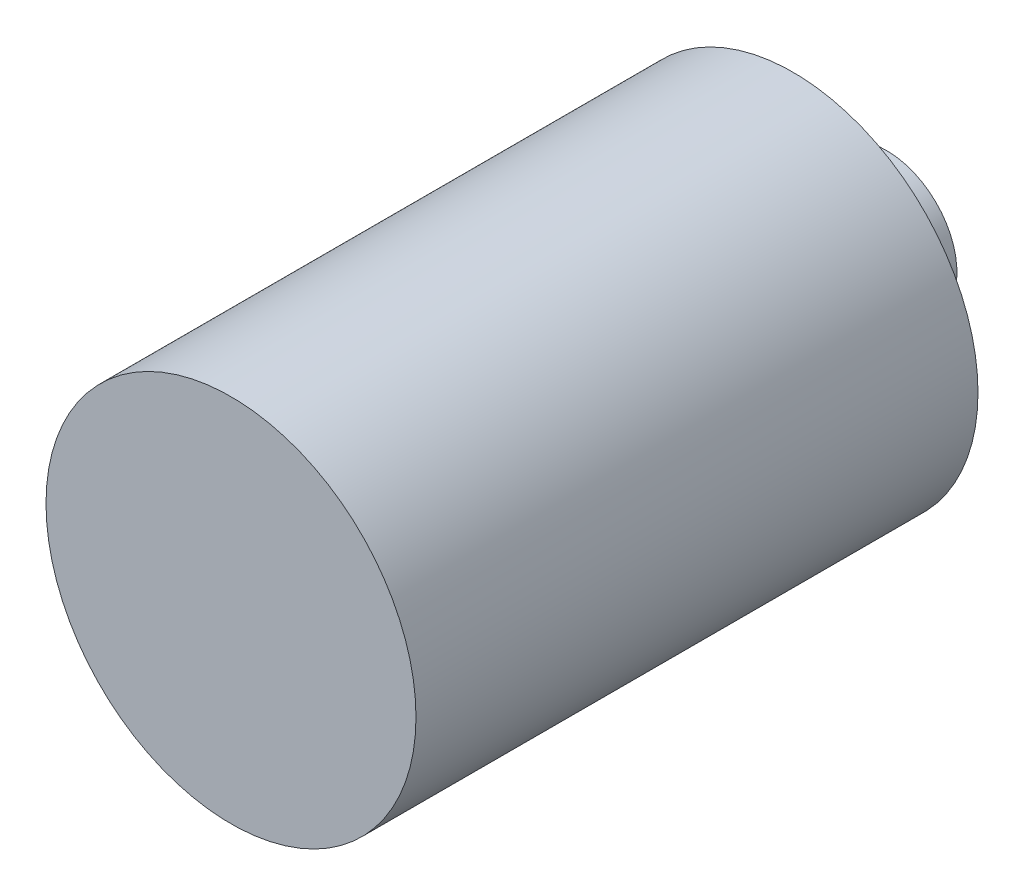
ISO-10303-21;
HEADER;
FILE_DESCRIPTION(('STEP AP214'),'2;1');
FILE_NAME('part.step','',(''),(''),'','','');
FILE_SCHEMA(('AUTOMOTIVE_DESIGN { 1 0 10303 214 1 1 1 1 }'));
ENDSEC;
DATA;
#1=APPLICATION_CONTEXT('core data for automotive mechanical design processes');
#2=APPLICATION_PROTOCOL_DEFINITION('international standard','automotive_design',2000,#1);
#3=PRODUCT_CONTEXT('',#1,'mechanical');
#4=PRODUCT('Part','Part','',(#3));
#5=PRODUCT_RELATED_PRODUCT_CATEGORY('part','',(#4));
#6=PRODUCT_DEFINITION_FORMATION('','',#4);
#7=PRODUCT_DEFINITION_CONTEXT('part definition',#1,'design');
#8=PRODUCT_DEFINITION('design','',#6,#7);
#9=PRODUCT_DEFINITION_SHAPE('','',#8);
#10=(LENGTH_UNIT() NAMED_UNIT(*) SI_UNIT(.MILLI.,.METRE.));
#11=(NAMED_UNIT(*) PLANE_ANGLE_UNIT() SI_UNIT($,.RADIAN.));
#12=(NAMED_UNIT(*) SI_UNIT($,.STERADIAN.) SOLID_ANGLE_UNIT());
#13=UNCERTAINTY_MEASURE_WITH_UNIT(LENGTH_MEASURE(1.E-05),#10,'distance_accuracy_value','');
#14=(GEOMETRIC_REPRESENTATION_CONTEXT(3) GLOBAL_UNCERTAINTY_ASSIGNED_CONTEXT((#13)) GLOBAL_UNIT_ASSIGNED_CONTEXT((#10,
#11,#12)) REPRESENTATION_CONTEXT('',''));
#15=CARTESIAN_POINT('',(0.,0.,0.));
#16=DIRECTION('',(0.,0.,1.));
#17=DIRECTION('',(1.,0.,0.));
#18=AXIS2_PLACEMENT_3D('',#15,#16,#17);
#19=CARTESIAN_POINT('',(0.,0.,12.));
#20=DIRECTION('',(0.,0.,-1.));
#21=DIRECTION('',(-1.,0.,0.));
#22=AXIS2_PLACEMENT_3D('',#19,#20,#21);
#23=CYLINDRICAL_SURFACE('',#22,3.95);
#24=CARTESIAN_POINT('',(0.,0.,12.));
#25=DIRECTION('',(0.,0.,1.));
#26=DIRECTION('',(1.,0.,0.));
#27=AXIS2_PLACEMENT_3D('',#24,#25,#26);
#28=CIRCLE('',#27,3.95);
#29=CARTESIAN_POINT('',(3.95,0.,12.));
#30=VERTEX_POINT('',#29);
#31=EDGE_CURVE('E39',#30,#30,#28,.T.);
#32=ORIENTED_EDGE('',*,*,#31,.F.);
#33=EDGE_LOOP('',(#32));
#34=FACE_BOUND('',#33,.T.);
#35=CARTESIAN_POINT('',(0.,0.,0.));
#36=DIRECTION('',(0.,0.,1.));
#37=DIRECTION('',(1.,0.,0.));
#38=AXIS2_PLACEMENT_3D('',#35,#36,#37);
#39=CIRCLE('',#38,3.95);
#40=CARTESIAN_POINT('',(3.95,0.,0.));
#41=VERTEX_POINT('',#40);
#42=EDGE_CURVE('E35',#41,#41,#39,.T.);
#43=ORIENTED_EDGE('',*,*,#42,.T.);
#44=EDGE_LOOP('',(#43));
#45=FACE_BOUND('',#44,.T.);
#46=ADVANCED_FACE('F32',(#34,#45),#23,.T.);
#47=CARTESIAN_POINT('',(0.,0.,12.));
#48=DIRECTION('',(0.,0.,1.));
#49=DIRECTION('',(1.,0.,0.));
#50=AXIS2_PLACEMENT_3D('',#47,#48,#49);
#51=PLANE('',#50);
#52=ORIENTED_EDGE('',*,*,#31,.T.);
#53=EDGE_LOOP('',(#52));
#54=FACE_BOUND('',#53,.T.);
#55=ADVANCED_FACE('F56',(#54),#51,.T.);
#56=CARTESIAN_POINT('',(0.,0.,0.));
#57=DIRECTION('',(0.,0.,1.));
#58=DIRECTION('',(1.,0.,0.));
#59=AXIS2_PLACEMENT_3D('',#56,#57,#58);
#60=PLANE('',#59);
#61=CARTESIAN_POINT('',(0.,0.,0.));
#62=DIRECTION('',(0.,0.,-1.));
#63=DIRECTION('',(-1.,0.,0.));
#64=AXIS2_PLACEMENT_3D('',#61,#62,#63);
#65=CIRCLE('',#64,1.5);
#66=CARTESIAN_POINT('',(-1.5,0.,0.));
#67=VERTEX_POINT('',#66);
#68=EDGE_CURVE('E10',#67,#67,#65,.T.);
#69=ORIENTED_EDGE('',*,*,#68,.F.);
#70=EDGE_LOOP('',(#69));
#71=FACE_BOUND('',#70,.T.);
#72=ORIENTED_EDGE('',*,*,#42,.F.);
#73=EDGE_LOOP('',(#72));
#74=FACE_BOUND('',#73,.T.);
#75=ADVANCED_FACE('F53',(#71,#74),#60,.F.);
#76=CARTESIAN_POINT('',(0.,0.,-2.));
#77=DIRECTION('',(0.,0.,1.));
#78=DIRECTION('',(1.,0.,0.));
#79=AXIS2_PLACEMENT_3D('',#76,#77,#78);
#80=CYLINDRICAL_SURFACE('',#79,1.5);
#81=CARTESIAN_POINT('',(0.,0.,-2.));
#82=DIRECTION('',(0.,0.,-1.));
#83=DIRECTION('',(-1.,0.,0.));
#84=AXIS2_PLACEMENT_3D('',#81,#82,#83);
#85=CIRCLE('',#84,1.5);
#86=CARTESIAN_POINT('',(-1.5,0.,-2.));
#87=VERTEX_POINT('',#86);
#88=EDGE_CURVE('E45',#87,#87,#85,.T.);
#89=ORIENTED_EDGE('',*,*,#88,.F.);
#90=EDGE_LOOP('',(#89));
#91=FACE_BOUND('',#90,.T.);
#92=ORIENTED_EDGE('',*,*,#68,.T.);
#93=EDGE_LOOP('',(#92));
#94=FACE_BOUND('',#93,.T.);
#95=ADVANCED_FACE('F55',(#91,#94),#80,.T.);
#96=CARTESIAN_POINT('',(0.,0.,-2.));
#97=DIRECTION('',(0.,0.,-1.));
#98=DIRECTION('',(-1.,0.,0.));
#99=AXIS2_PLACEMENT_3D('',#96,#97,#98);
#100=PLANE('',#99);
#101=ORIENTED_EDGE('',*,*,#88,.T.);
#102=EDGE_LOOP('',(#101));
#103=FACE_BOUND('',#102,.T.);
#104=ADVANCED_FACE('F62',(#103),#100,.T.);
#105=CLOSED_SHELL('',(#46,#55,#75,#95,#104));
#106=MANIFOLD_SOLID_BREP('B2',#105);
#107=ADVANCED_BREP_SHAPE_REPRESENTATION('',(#18,#106),#14);
#108=SHAPE_DEFINITION_REPRESENTATION(#9,#107);
ENDSEC;
END-ISO-10303-21;
